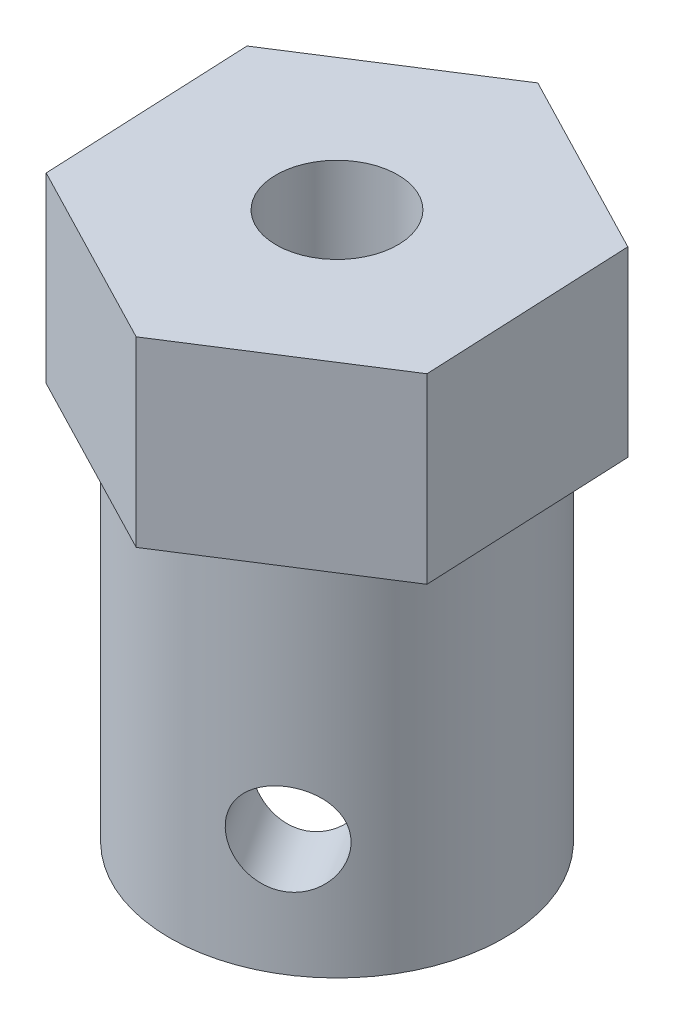
ISO-10303-21;
HEADER;
FILE_DESCRIPTION(('STEP AP214'),'2;1');
FILE_NAME('part.step','',(''),(''),'','','');
FILE_SCHEMA(('AUTOMOTIVE_DESIGN { 1 0 10303 214 1 1 1 1 }'));
ENDSEC;
DATA;
#1=APPLICATION_CONTEXT('core data for automotive mechanical design processes');
#2=APPLICATION_PROTOCOL_DEFINITION('international standard','automotive_design',2000,#1);
#3=PRODUCT_CONTEXT('',#1,'mechanical');
#4=PRODUCT('Part','Part','',(#3));
#5=PRODUCT_RELATED_PRODUCT_CATEGORY('part','',(#4));
#6=PRODUCT_DEFINITION_FORMATION('','',#4);
#7=PRODUCT_DEFINITION_CONTEXT('part definition',#1,'design');
#8=PRODUCT_DEFINITION('design','',#6,#7);
#9=PRODUCT_DEFINITION_SHAPE('','',#8);
#10=(LENGTH_UNIT() NAMED_UNIT(*) SI_UNIT(.MILLI.,.METRE.));
#11=(NAMED_UNIT(*) PLANE_ANGLE_UNIT() SI_UNIT($,.RADIAN.));
#12=(NAMED_UNIT(*) SI_UNIT($,.STERADIAN.) SOLID_ANGLE_UNIT());
#13=UNCERTAINTY_MEASURE_WITH_UNIT(LENGTH_MEASURE(1.E-05),#10,'distance_accuracy_value','');
#14=(GEOMETRIC_REPRESENTATION_CONTEXT(3) GLOBAL_UNCERTAINTY_ASSIGNED_CONTEXT((#13)) GLOBAL_UNIT_ASSIGNED_CONTEXT((#10,
#11,#12)) REPRESENTATION_CONTEXT('',''));
#15=CARTESIAN_POINT('',(0.,0.,0.));
#16=DIRECTION('',(0.,0.,1.));
#17=DIRECTION('',(1.,0.,0.));
#18=AXIS2_PLACEMENT_3D('',#15,#16,#17);
#19=CARTESIAN_POINT('',(0.,0.,0.));
#20=DIRECTION('',(0.,1.,0.));
#21=DIRECTION('',(0.,0.,1.));
#22=AXIS2_PLACEMENT_3D('',#19,#20,#21);
#23=PLANE('',#22);
#24=CARTESIAN_POINT('',(0.,0.,0.));
#25=DIRECTION('',(0.,1.,0.));
#26=DIRECTION('',(0.,0.,1.));
#27=AXIS2_PLACEMENT_3D('',#24,#25,#26);
#28=CIRCLE('',#27,2.);
#29=CARTESIAN_POINT('',(0.,0.,2.));
#30=VERTEX_POINT('',#29);
#31=EDGE_CURVE('E238',#30,#30,#28,.T.);
#32=ORIENTED_EDGE('',*,*,#31,.T.);
#33=EDGE_LOOP('',(#32));
#34=FACE_BOUND('',#33,.T.);
#35=CARTESIAN_POINT('',(0.,0.,0.));
#36=DIRECTION('',(0.,1.,0.));
#37=DIRECTION('',(0.,0.,1.));
#38=AXIS2_PLACEMENT_3D('',#35,#36,#37);
#39=CIRCLE('',#38,3.);
#40=CARTESIAN_POINT('',(0.,0.,3.));
#41=VERTEX_POINT('',#40);
#42=EDGE_CURVE('E12',#41,#41,#39,.T.);
#43=ORIENTED_EDGE('',*,*,#42,.F.);
#44=EDGE_LOOP('',(#43));
#45=FACE_BOUND('',#44,.T.);
#46=ADVANCED_FACE('F61',(#34,#45),#23,.F.);
#47=CARTESIAN_POINT('',(0.,6.,0.));
#48=DIRECTION('',(0.,1.,0.));
#49=DIRECTION('',(0.,0.,1.));
#50=AXIS2_PLACEMENT_3D('',#47,#48,#49);
#51=PLANE('',#50);
#52=DIRECTION('',(0.0452524047716099,0.,0.998975585218371));
#53=VECTOR('',#52,1.);
#54=CARTESIAN_POINT('',(-6.15061243976842,6.,-3.18903850960848));
#55=LINE('',#54,#53);
#56=CARTESIAN_POINT('',(-6.15061243976842,6.,-3.18903850960848));
#57=VERTEX_POINT('',#56);
#58=CARTESIAN_POINT('',(-5.83709458285202,6.,3.73206736686781));
#59=VERTEX_POINT('',#58);
#60=EDGE_CURVE('E165',#57,#59,#55,.T.);
#61=ORIENTED_EDGE('',*,*,#60,.T.);
#62=DIRECTION('',(0.887764436945341,0.,0.460298060494635));
#63=VECTOR('',#62,1.);
#64=CARTESIAN_POINT('',(-5.83709458285202,6.,3.73206736686781));
#65=LINE('',#64,#63);
#66=CARTESIAN_POINT('',(0.313517856916401,6.,6.92110587647628));
#67=VERTEX_POINT('',#66);
#68=EDGE_CURVE('E122',#59,#67,#65,.T.);
#69=ORIENTED_EDGE('',*,*,#68,.T.);
#70=DIRECTION('',(0.84251203217373,0.,-0.538677524723736));
#71=VECTOR('',#70,1.);
#72=CARTESIAN_POINT('',(0.313517856916401,6.,6.92110587647628));
#73=LINE('',#72,#71);
#74=CARTESIAN_POINT('',(6.15061243976842,6.,3.18903850960848));
#75=VERTEX_POINT('',#74);
#76=EDGE_CURVE('E136',#67,#75,#73,.T.);
#77=ORIENTED_EDGE('',*,*,#76,.T.);
#78=DIRECTION('',(-0.04525240477161,0.,-0.998975585218371));
#79=VECTOR('',#78,1.);
#80=CARTESIAN_POINT('',(6.15061243976842,6.,3.18903850960848));
#81=LINE('',#80,#79);
#82=CARTESIAN_POINT('',(5.83709458285202,6.,-3.7320673668678));
#83=VERTEX_POINT('',#82);
#84=EDGE_CURVE('E129',#75,#83,#81,.T.);
#85=ORIENTED_EDGE('',*,*,#84,.T.);
#86=DIRECTION('',(-0.88776443694534,0.,-0.460298060494635));
#87=VECTOR('',#86,1.);
#88=CARTESIAN_POINT('',(5.83709458285202,6.,-3.7320673668678));
#89=LINE('',#88,#87);
#90=CARTESIAN_POINT('',(-0.313517856916401,6.,-6.92110587647628));
#91=VERTEX_POINT('',#90);
#92=EDGE_CURVE('E134',#83,#91,#89,.T.);
#93=ORIENTED_EDGE('',*,*,#92,.T.);
#94=DIRECTION('',(-0.84251203217373,0.,0.538677524723736));
#95=VECTOR('',#94,1.);
#96=CARTESIAN_POINT('',(-0.313517856916401,6.,-6.92110587647628));
#97=LINE('',#96,#95);
#98=EDGE_CURVE('E84',#91,#57,#97,.T.);
#99=ORIENTED_EDGE('',*,*,#98,.T.);
#100=EDGE_LOOP('',(#61,#69,#77,#85,#93,#99));
#101=FACE_BOUND('',#100,.T.);
#102=CARTESIAN_POINT('',(0.,6.,0.));
#103=DIRECTION('',(0.,1.,0.));
#104=DIRECTION('',(0.,0.,1.));
#105=AXIS2_PLACEMENT_3D('',#102,#103,#104);
#106=CIRCLE('',#105,2.);
#107=CARTESIAN_POINT('',(0.,6.,2.));
#108=VERTEX_POINT('',#107);
#109=EDGE_CURVE('E158',#108,#108,#106,.T.);
#110=ORIENTED_EDGE('',*,*,#109,.F.);
#111=EDGE_LOOP('',(#110));
#112=FACE_BOUND('',#111,.T.);
#113=ADVANCED_FACE('F131',(#101,#112),#51,.T.);
#114=CARTESIAN_POINT('',(0.,0.,0.));
#115=DIRECTION('',(0.,1.,0.));
#116=DIRECTION('',(0.,0.,1.));
#117=AXIS2_PLACEMENT_3D('',#114,#115,#116);
#118=CIRCLE('',#117,5.5);
#119=CARTESIAN_POINT('',(0.,0.,5.5));
#120=VERTEX_POINT('',#119);
#121=EDGE_CURVE('E257',#120,#120,#118,.T.);
#122=ORIENTED_EDGE('',*,*,#121,.T.);
#123=EDGE_LOOP('',(#122));
#124=FACE_BOUND('',#123,.T.);
#125=DIRECTION('',(0.0452524047716099,0.,0.998975585218371));
#126=VECTOR('',#125,1.);
#127=CARTESIAN_POINT('',(-6.15061243976842,0.,-3.18903850960848));
#128=LINE('',#127,#126);
#129=CARTESIAN_POINT('',(-6.15061243976842,0.,-3.18903850960848));
#130=VERTEX_POINT('',#129);
#131=CARTESIAN_POINT('',(-5.83709458285202,0.,3.73206736686781));
#132=VERTEX_POINT('',#131);
#133=EDGE_CURVE('E154',#130,#132,#128,.T.);
#134=ORIENTED_EDGE('',*,*,#133,.F.);
#135=DIRECTION('',(-0.84251203217373,0.,0.538677524723736));
#136=VECTOR('',#135,1.);
#137=CARTESIAN_POINT('',(-0.313517856916401,0.,-6.92110587647628));
#138=LINE('',#137,#136);
#139=CARTESIAN_POINT('',(-0.313517856916401,0.,-6.92110587647628));
#140=VERTEX_POINT('',#139);
#141=EDGE_CURVE('E113',#140,#130,#138,.T.);
#142=ORIENTED_EDGE('',*,*,#141,.F.);
#143=DIRECTION('',(-0.88776443694534,0.,-0.460298060494635));
#144=VECTOR('',#143,1.);
#145=CARTESIAN_POINT('',(5.83709458285202,0.,-3.7320673668678));
#146=LINE('',#145,#144);
#147=CARTESIAN_POINT('',(5.83709458285202,0.,-3.7320673668678));
#148=VERTEX_POINT('',#147);
#149=EDGE_CURVE('E107',#148,#140,#146,.T.);
#150=ORIENTED_EDGE('',*,*,#149,.F.);
#151=DIRECTION('',(-0.04525240477161,0.,-0.998975585218371));
#152=VECTOR('',#151,1.);
#153=CARTESIAN_POINT('',(6.15061243976842,0.,3.18903850960848));
#154=LINE('',#153,#152);
#155=CARTESIAN_POINT('',(6.15061243976842,0.,3.18903850960848));
#156=VERTEX_POINT('',#155);
#157=EDGE_CURVE('E144',#156,#148,#154,.T.);
#158=ORIENTED_EDGE('',*,*,#157,.F.);
#159=DIRECTION('',(0.84251203217373,0.,-0.538677524723736));
#160=VECTOR('',#159,1.);
#161=CARTESIAN_POINT('',(0.313517856916401,0.,6.92110587647628));
#162=LINE('',#161,#160);
#163=CARTESIAN_POINT('',(0.313517856916401,0.,6.92110587647628));
#164=VERTEX_POINT('',#163);
#165=EDGE_CURVE('E160',#164,#156,#162,.T.);
#166=ORIENTED_EDGE('',*,*,#165,.F.);
#167=DIRECTION('',(0.887764436945341,0.,0.460298060494635));
#168=VECTOR('',#167,1.);
#169=CARTESIAN_POINT('',(-5.83709458285202,0.,3.73206736686781));
#170=LINE('',#169,#168);
#171=EDGE_CURVE('E157',#132,#164,#170,.T.);
#172=ORIENTED_EDGE('',*,*,#171,.F.);
#173=EDGE_LOOP('',(#134,#142,#150,#158,#166,#172));
#174=FACE_BOUND('',#173,.T.);
#175=ADVANCED_FACE('F212',(#124,#174),#23,.F.);
#176=CARTESIAN_POINT('',(-6.15061243976842,6.,-3.18903850960848));
#177=DIRECTION('',(0.998975585218371,0.,-0.0452524047716099));
#178=DIRECTION('',(-0.0452524047716099,0.,-0.998975585218371));
#179=AXIS2_PLACEMENT_3D('',#176,#177,#178);
#180=PLANE('',#179);
#181=ORIENTED_EDGE('',*,*,#133,.T.);
#182=DIRECTION('',(0.,-1.,0.));
#183=VECTOR('',#182,1.);
#184=CARTESIAN_POINT('',(-5.83709458285202,6.,3.73206736686781));
#185=LINE('',#184,#183);
#186=EDGE_CURVE('E75',#59,#132,#185,.T.);
#187=ORIENTED_EDGE('',*,*,#186,.F.);
#188=ORIENTED_EDGE('',*,*,#60,.F.);
#189=DIRECTION('',(0.,-1.,0.));
#190=VECTOR('',#189,1.);
#191=CARTESIAN_POINT('',(-6.15061243976842,6.,-3.18903850960848));
#192=LINE('',#191,#190);
#193=EDGE_CURVE('E150',#57,#130,#192,.T.);
#194=ORIENTED_EDGE('',*,*,#193,.T.);
#195=EDGE_LOOP('',(#181,#187,#188,#194));
#196=FACE_BOUND('',#195,.T.);
#197=ADVANCED_FACE('F63',(#196),#180,.F.);
#198=CARTESIAN_POINT('',(-5.83709458285202,6.,3.73206736686781));
#199=DIRECTION('',(0.460298060494635,0.,-0.887764436945341));
#200=DIRECTION('',(-0.887764436945341,0.,-0.460298060494635));
#201=AXIS2_PLACEMENT_3D('',#198,#199,#200);
#202=PLANE('',#201);
#203=ORIENTED_EDGE('',*,*,#171,.T.);
#204=DIRECTION('',(0.,-1.,0.));
#205=VECTOR('',#204,1.);
#206=CARTESIAN_POINT('',(0.313517856916401,6.,6.92110587647628));
#207=LINE('',#206,#205);
#208=EDGE_CURVE('E169',#67,#164,#207,.T.);
#209=ORIENTED_EDGE('',*,*,#208,.F.);
#210=ORIENTED_EDGE('',*,*,#68,.F.);
#211=ORIENTED_EDGE('',*,*,#186,.T.);
#212=EDGE_LOOP('',(#203,#209,#210,#211));
#213=FACE_BOUND('',#212,.T.);
#214=ADVANCED_FACE('F224',(#213),#202,.F.);
#215=CARTESIAN_POINT('',(0.313517856916401,6.,6.92110587647628));
#216=DIRECTION('',(-0.538677524723736,0.,-0.84251203217373));
#217=DIRECTION('',(-0.84251203217373,0.,0.538677524723736));
#218=AXIS2_PLACEMENT_3D('',#215,#216,#217);
#219=PLANE('',#218);
#220=ORIENTED_EDGE('',*,*,#165,.T.);
#221=DIRECTION('',(0.,-1.,0.));
#222=VECTOR('',#221,1.);
#223=CARTESIAN_POINT('',(6.15061243976842,6.,3.18903850960848));
#224=LINE('',#223,#222);
#225=EDGE_CURVE('E145',#75,#156,#224,.T.);
#226=ORIENTED_EDGE('',*,*,#225,.F.);
#227=ORIENTED_EDGE('',*,*,#76,.F.);
#228=ORIENTED_EDGE('',*,*,#208,.T.);
#229=EDGE_LOOP('',(#220,#226,#227,#228));
#230=FACE_BOUND('',#229,.T.);
#231=ADVANCED_FACE('F222',(#230),#219,.F.);
#232=CARTESIAN_POINT('',(6.15061243976842,6.,3.18903850960848));
#233=DIRECTION('',(-0.998975585218371,0.,0.04525240477161));
#234=DIRECTION('',(0.04525240477161,0.,0.998975585218371));
#235=AXIS2_PLACEMENT_3D('',#232,#233,#234);
#236=PLANE('',#235);
#237=ORIENTED_EDGE('',*,*,#157,.T.);
#238=DIRECTION('',(0.,-1.,0.));
#239=VECTOR('',#238,1.);
#240=CARTESIAN_POINT('',(5.83709458285202,6.,-3.7320673668678));
#241=LINE('',#240,#239);
#242=EDGE_CURVE('E141',#83,#148,#241,.T.);
#243=ORIENTED_EDGE('',*,*,#242,.F.);
#244=ORIENTED_EDGE('',*,*,#84,.F.);
#245=ORIENTED_EDGE('',*,*,#225,.T.);
#246=EDGE_LOOP('',(#237,#243,#244,#245));
#247=FACE_BOUND('',#246,.T.);
#248=ADVANCED_FACE('F142',(#247),#236,.F.);
#249=CARTESIAN_POINT('',(5.83709458285202,6.,-3.7320673668678));
#250=DIRECTION('',(-0.460298060494635,0.,0.88776443694534));
#251=DIRECTION('',(0.88776443694534,0.,0.460298060494635));
#252=AXIS2_PLACEMENT_3D('',#249,#250,#251);
#253=PLANE('',#252);
#254=ORIENTED_EDGE('',*,*,#149,.T.);
#255=DIRECTION('',(0.,-1.,0.));
#256=VECTOR('',#255,1.);
#257=CARTESIAN_POINT('',(-0.313517856916401,6.,-6.92110587647628));
#258=LINE('',#257,#256);
#259=EDGE_CURVE('E146',#91,#140,#258,.T.);
#260=ORIENTED_EDGE('',*,*,#259,.F.);
#261=ORIENTED_EDGE('',*,*,#92,.F.);
#262=ORIENTED_EDGE('',*,*,#242,.T.);
#263=EDGE_LOOP('',(#254,#260,#261,#262));
#264=FACE_BOUND('',#263,.T.);
#265=ADVANCED_FACE('F148',(#264),#253,.F.);
#266=CARTESIAN_POINT('',(-0.313517856916401,6.,-6.92110587647628));
#267=DIRECTION('',(0.538677524723736,0.,0.84251203217373));
#268=DIRECTION('',(0.84251203217373,0.,-0.538677524723736));
#269=AXIS2_PLACEMENT_3D('',#266,#267,#268);
#270=PLANE('',#269);
#271=ORIENTED_EDGE('',*,*,#141,.T.);
#272=ORIENTED_EDGE('',*,*,#193,.F.);
#273=ORIENTED_EDGE('',*,*,#98,.F.);
#274=ORIENTED_EDGE('',*,*,#259,.T.);
#275=EDGE_LOOP('',(#271,#272,#273,#274));
#276=FACE_BOUND('',#275,.T.);
#277=ADVANCED_FACE('F208',(#276),#270,.F.);
#278=CARTESIAN_POINT('',(0.,6.,0.));
#279=DIRECTION('',(0.,-1.,0.));
#280=DIRECTION('',(0.,0.,-1.));
#281=AXIS2_PLACEMENT_3D('',#278,#279,#280);
#282=CYLINDRICAL_SURFACE('',#281,2.);
#283=ORIENTED_EDGE('',*,*,#109,.T.);
#284=EDGE_LOOP('',(#283));
#285=FACE_BOUND('',#284,.T.);
#286=ORIENTED_EDGE('',*,*,#31,.F.);
#287=EDGE_LOOP('',(#286));
#288=FACE_BOUND('',#287,.T.);
#289=ADVANCED_FACE('F203',(#285,#288),#282,.F.);
#290=CARTESIAN_POINT('',(0.,-12.,0.));
#291=DIRECTION('',(0.,1.,0.));
#292=DIRECTION('',(0.,0.,1.));
#293=AXIS2_PLACEMENT_3D('',#290,#291,#292);
#294=CYLINDRICAL_SURFACE('',#293,5.5);
#295=CARTESIAN_POINT('',(-1.58664548629711,-8.13531336875809,-5.26617091450828));
#296=CARTESIAN_POINT('',(-1.58664777016669,-8.21786981978584,-5.26617106516967));
#297=CARTESIAN_POINT('',(-1.59345936672199,-8.30044547871361,-5.26413257461352));
#298=CARTESIAN_POINT('',(-1.62038031709061,-8.4632068940581,-5.25590708693958));
#299=CARTESIAN_POINT('',(-1.64049594478426,-8.54339150425664,-5.24971813253758));
#300=CARTESIAN_POINT('',(-1.693050107084,-8.69899255671995,-5.23300435444098));
#301=CARTESIAN_POINT('',(-1.72547077097341,-8.77441572966232,-5.22248581677659));
#302=CARTESIAN_POINT('',(-1.80127198306013,-8.9186715029948,-5.19682728662904));
#303=CARTESIAN_POINT('',(-1.84465352505905,-8.98750350499539,-5.18168687506357));
#304=CARTESIAN_POINT('',(-1.94188458740173,-9.11842357554944,-5.14604909490239));
#305=CARTESIAN_POINT('',(-1.99595737215188,-9.18031369713614,-5.1254335241561));
#306=CARTESIAN_POINT('',(-2.11195017653896,-9.29384102648359,-5.07873697476655));
#307=CARTESIAN_POINT('',(-2.1738710404009,-9.34547712967411,-5.05265540794358));
#308=CARTESIAN_POINT('',(-2.30457188515124,-9.43786199556857,-4.99441133365275));
#309=CARTESIAN_POINT('',(-2.37344969328434,-9.47841309058454,-4.9621539507149));
#310=CARTESIAN_POINT('',(-2.51481410486096,-9.54618623694096,-4.89202673795153));
#311=CARTESIAN_POINT('',(-2.58730006818645,-9.57341064333231,-4.8541579013066));
#312=CARTESIAN_POINT('',(-2.73167864239386,-9.61311446703863,-4.77436584608916));
#313=CARTESIAN_POINT('',(-2.80354401383391,-9.62593081297283,-4.7325611906872));
#314=CARTESIAN_POINT('',(-2.94608718339089,-9.63751567105605,-4.6451646049233));
#315=CARTESIAN_POINT('',(-3.01676518689381,-9.63628663830257,-4.5995733378348));
#316=CARTESIAN_POINT('',(-3.15299761147534,-9.6200509701097,-4.50723903067167));
#317=CARTESIAN_POINT('',(-3.21863799263807,-9.60540849543884,-4.4605580635869));
#318=CARTESIAN_POINT('',(-3.34514127100844,-9.56335103641251,-4.36649137432479));
#319=CARTESIAN_POINT('',(-3.40600388945077,-9.53593530742975,-4.31910561121671));
#320=CARTESIAN_POINT('',(-3.52224280421983,-9.46883623291507,-4.22486293086914));
#321=CARTESIAN_POINT('',(-3.57755641118083,-9.42902992007039,-4.17801642617775));
#322=CARTESIAN_POINT('',(-3.68100820702582,-9.3383744744907,-4.08716594852856));
#323=CARTESIAN_POINT('',(-3.72914493877198,-9.28752310438675,-4.04316255383889));
#324=CARTESIAN_POINT('',(-3.81895967792232,-9.17429537363724,-3.95846983103785));
#325=CARTESIAN_POINT('',(-3.8603810350516,-9.11160169681731,-3.9179320489933));
#326=CARTESIAN_POINT('',(-3.93427182057672,-8.97746815364475,-3.84372929781715));
#327=CARTESIAN_POINT('',(-3.96674065002523,-8.90602770257171,-3.81006478856443));
#328=CARTESIAN_POINT('',(-4.02248080978718,-8.75575897475774,-3.75117457035836));
#329=CARTESIAN_POINT('',(-4.04568899406952,-8.67688436298389,-3.72600697279649));
#330=CARTESIAN_POINT('',(-4.08224446318487,-8.51439076652899,-3.68592244763783));
#331=CARTESIAN_POINT('',(-4.09559432347185,-8.43077302712528,-3.67100284285863));
#332=CARTESIAN_POINT('',(-4.11196129700803,-8.26396118724811,-3.65265954797318));
#333=CARTESIAN_POINT('',(-4.11528762997759,-8.18083518199399,-3.64889189406068));
#334=CARTESIAN_POINT('',(-4.11243165437271,-8.01496222521603,-3.65211046293392));
#335=CARTESIAN_POINT('',(-4.10625041096462,-7.93221523227181,-3.65909548106106));
#336=CARTESIAN_POINT('',(-4.08470617552967,-7.77119093144673,-3.68312697318836));
#337=CARTESIAN_POINT('',(-4.06953246135745,-7.69285694812831,-3.69996594705448));
#338=CARTESIAN_POINT('',(-4.03038055800088,-7.54096735882748,-3.7425745523789));
#339=CARTESIAN_POINT('',(-4.00640118043988,-7.46741239938041,-3.76834538921884));
#340=CARTESIAN_POINT('',(-3.94930052562109,-7.32531266059111,-3.82815452486727));
#341=CARTESIAN_POINT('',(-3.9159828514383,-7.25692079425312,-3.86236830140298));
#342=CARTESIAN_POINT('',(-3.8408745072584,-7.12874730337295,-3.93706526236668));
#343=CARTESIAN_POINT('',(-3.79908216843843,-7.06896737865797,-3.97754968123216));
#344=CARTESIAN_POINT('',(-3.70617184009726,-6.95784700480749,-4.06428875366022));
#345=CARTESIAN_POINT('',(-3.65480897170384,-6.9068183653239,-4.11068140920305));
#346=CARTESIAN_POINT('',(-3.54449139129223,-6.81694273366711,-4.20617342213235));
#347=CARTESIAN_POINT('',(-3.48553708339561,-6.77809509343028,-4.2552726353588));
#348=CARTESIAN_POINT('',(-3.36169152581016,-6.71404630250018,-4.3537610409909));
#349=CARTESIAN_POINT('',(-3.29684943281606,-6.6887424784576,-4.40314509758631));
#350=CARTESIAN_POINT('',(-3.16243311213076,-6.65220641621302,-4.50065572057294));
#351=CARTESIAN_POINT('',(-3.09285998911574,-6.64097090493117,-4.54878257690733));
#352=CARTESIAN_POINT('',(-2.95324410559726,-6.63310324866752,-4.64059348656859));
#353=CARTESIAN_POINT('',(-2.88328783052829,-6.63601469745139,-4.68437048685015));
#354=CARTESIAN_POINT('',(-2.7428655361739,-6.65529314606808,-4.76795188886995));
#355=CARTESIAN_POINT('',(-2.67239953773437,-6.67165959868837,-4.80775645209264));
#356=CARTESIAN_POINT('',(-2.53365758754882,-6.71712073909757,-4.88228841172423));
#357=CARTESIAN_POINT('',(-2.46536917612926,-6.74611906699834,-4.91705164011164));
#358=CARTESIAN_POINT('',(-2.33251961284288,-6.8159349902932,-4.98144638594317));
#359=CARTESIAN_POINT('',(-2.26795900340167,-6.85675430056471,-5.01107715782113));
#360=CARTESIAN_POINT('',(-2.14285199702232,-6.9503680970398,-5.06586434482068));
#361=CARTESIAN_POINT('',(-2.08246591334054,-7.00346244119474,-5.09087442101908));
#362=CARTESIAN_POINT('',(-1.96974695776189,-7.11955550730832,-5.13554092608867));
#363=CARTESIAN_POINT('',(-1.91741624181717,-7.18255687170936,-5.15519592279741));
#364=CARTESIAN_POINT('',(-1.82159069743897,-7.31844089558902,-5.18984292567382));
#365=CARTESIAN_POINT('',(-1.77833013066899,-7.3915195714389,-5.20471562570376));
#366=CARTESIAN_POINT('',(-1.70404793372958,-7.54439931390771,-5.22950897578839));
#367=CARTESIAN_POINT('',(-1.67301865106361,-7.6241961392684,-5.23943272318656));
#368=CARTESIAN_POINT('',(-1.62834502170823,-7.77558138801065,-5.2534703137873));
#369=CARTESIAN_POINT('',(-1.61275947367049,-7.84654183750962,-5.25824346440209));
#370=CARTESIAN_POINT('',(-1.59190935457165,-7.99010116666081,-5.26459349627581));
#371=CARTESIAN_POINT('',(-1.58664347749183,-8.0626998378094,-5.26617078199223));
#372=CARTESIAN_POINT('',(-1.58664548629711,-8.13531336875809,-5.26617091450828));
#373=B_SPLINE_CURVE_WITH_KNOTS('',3,(#295,#296,#297,#298,#299,#300,#301,#302,#303,#304,#305,
#306,#307,#308,#309,#310,#311,#312,#313,#314,#315,#316,#317,#318,#319,#320,#321,#322,#323,#324,
#325,#326,#327,#328,#329,#330,#331,#332,#333,#334,#335,#336,#337,#338,#339,#340,#341,#342,#343,
#344,#345,#346,#347,#348,#349,#350,#351,#352,#353,#354,#355,#356,#357,#358,#359,#360,#361,#362,
#363,#364,#365,#366,#367,#368,#369,#370,#371,#372),.UNSPECIFIED.,.T.,.F.,(4,2,2,2,2,2,2,2,2,2,2,
2,2,2,2,2,2,2,2,2,2,2,2,2,2,2,2,2,2,2,2,2,2,2,2,2,2,2,4),(0.,0.247402201391967,
0.494921155336741,0.742082002291409,0.989265266888851,1.24229327000825,1.49534851471804,
1.75265882819585,2.00992365416646,2.26103843021061,2.51210931268384,2.75655962385663,
3.0010241872433,3.24799669713117,3.49501928234234,3.74996416866223,4.00492610732058,
4.26159801830625,4.51820285087414,4.76680611540842,5.01538153009582,5.25890187447337,
5.50245509545498,5.75157425489228,6.0007425183582,6.25748556676548,6.51421495339717,
6.76896951768222,7.02366480072505,7.27019876040454,7.51672269408902,7.76139812559489,
8.00610907011738,8.25758505394755,8.50912822664454,8.76653181226182,9.02377409687475,
9.24140725781328,9.45901287413893),.UNSPECIFIED.);
#374=CARTESIAN_POINT('',(-1.58664548629711,-8.13531336875809,-5.26617091450828));
#375=VERTEX_POINT('',#374);
#376=EDGE_CURVE('E194',#375,#375,#373,.T.);
#377=ORIENTED_EDGE('',*,*,#376,.F.);
#378=EDGE_LOOP('',(#377));
#379=FACE_BOUND('',#378,.T.);
#380=CARTESIAN_POINT('',(4.1141815828183,-8.13531336875809,3.65013834033708));
#381=CARTESIAN_POINT('',(4.11418076113849,-8.05275691773035,3.65014047659581));
#382=CARTESIAN_POINT('',(4.10947194740852,-7.97018125880258,3.65546779905988));
#383=CARTESIAN_POINT('',(4.09070834008802,-7.80741984345809,3.67645167993415));
#384=CARTESIAN_POINT('',(4.07664913704777,-7.72723523325955,3.6921131116686));
#385=CARTESIAN_POINT('',(4.03942378376224,-7.57163418079625,3.73280172710409));
#386=CARTESIAN_POINT('',(4.01627083875048,-7.49621100785387,3.75781532778272));
#387=CARTESIAN_POINT('',(3.96117077653158,-7.35195523452139,3.81585123965306));
#388=CARTESIAN_POINT('',(3.92922286187801,-7.2831232325208,3.84887427703401));
#389=CARTESIAN_POINT('',(3.85607168618777,-7.15220316196675,3.92217391110021));
#390=CARTESIAN_POINT('',(3.81466744129146,-7.09031304038005,3.96260355755424));
#391=CARTESIAN_POINT('',(3.7236049689171,-6.9767857110326,4.04829208957305));
#392=CARTESIAN_POINT('',(3.67394585327578,-6.92514960784208,4.09355149459646));
#393=CARTESIAN_POINT('',(3.56622959649277,-6.83276474194762,4.18774433420279));
#394=CARTESIAN_POINT('',(3.50804528484731,-6.79221364693165,4.23672675028819));
#395=CARTESIAN_POINT('',(3.38506788803837,-6.72444050057523,4.33561194991108));
#396=CARTESIAN_POINT('',(3.32027597299708,-6.69721609418388,4.38551456921456));
#397=CARTESIAN_POINT('',(3.18726104507035,-6.65751227047756,4.48307979721425));
#398=CARTESIAN_POINT('',(3.11915708126281,-6.64469592454336,4.53076743648476));
#399=CARTESIAN_POINT('',(2.9800098712862,-6.63311106646014,4.62347543153515));
#400=CARTESIAN_POINT('',(2.90896714096935,-6.63434009921362,4.66849625208544));
#401=CARTESIAN_POINT('',(2.76798636072728,-6.65057576740649,4.75340395131816));
#402=CARTESIAN_POINT('',(2.69806858008716,-6.66521824207735,4.7933949037639));
#403=CARTESIAN_POINT('',(2.55959820917515,-6.70727570110368,4.86874460745725));
#404=CARTESIAN_POINT('',(2.49104569873577,-6.73469143008644,4.90410308849717));
#405=CARTESIAN_POINT('',(2.35672305490555,-6.80179050460112,4.97006213230652));
#406=CARTESIAN_POINT('',(2.29098868060764,-6.8415968174458,5.00061016256215));
#407=CARTESIAN_POINT('',(2.16511124034073,-6.9322522630255,5.05638608375122));
#408=CARTESIAN_POINT('',(2.10496931074913,-6.98310363312944,5.0816128947351));
#409=CARTESIAN_POINT('',(1.99040400209712,-7.09633136387895,5.12759479027635));
#410=CARTESIAN_POINT('',(1.93622588313687,-7.15902504069888,5.1481805141026));
#411=CARTESIAN_POINT('',(1.83786469578657,-7.29315858387144,5.18411063086653));
#412=CARTESIAN_POINT('',(1.79368229617157,-7.36459903494449,5.1994546731385));
#413=CARTESIAN_POINT('',(1.71683702450158,-7.51486776275846,5.22533569770497));
#414=CARTESIAN_POINT('',(1.68425339868571,-7.59374237453231,5.23583974994259));
#415=CARTESIAN_POINT('',(1.63252867875679,-7.75623597098721,5.25219899282583));
#416=CARTESIAN_POINT('',(1.61338407380939,-7.83985371039092,5.25805539768356));
#417=CARTESIAN_POINT('',(1.58986569733114,-8.00666555026808,5.26521362775922));
#418=CARTESIAN_POINT('',(1.58504995015475,-8.08979155552221,5.26665178149294));
#419=CARTESIAN_POINT('',(1.5891699143992,-8.25566451230016,5.26541013868118));
#420=CARTESIAN_POINT('',(1.59810408536966,-8.33841150524438,5.26273080343213));
#421=CARTESIAN_POINT('',(1.62895820458089,-8.49943580606946,5.25326032181601));
#422=CARTESIAN_POINT('',(1.65061037711835,-8.57776978938788,5.24655390197738));
#423=CARTESIAN_POINT('',(1.70571576726803,-8.72965937868871,5.2288971536758));
#424=CARTESIAN_POINT('',(1.73917057769248,-8.80321433813578,5.21794625238376));
#425=CARTESIAN_POINT('',(1.81742087246467,-8.94531407692508,5.19121595392279));
#426=CARTESIAN_POINT('',(1.86245805381,-9.01370594326308,5.17533193005431));
#427=CARTESIAN_POINT('',(1.96177877997117,-9.14187943414324,5.13850405070354));
#428=CARTESIAN_POINT('',(2.01606414559352,-9.20165935885822,5.11755919849191));
#429=CARTESIAN_POINT('',(2.1337859677135,-9.3127797327087,5.06962624119844));
#430=CARTESIAN_POINT('',(2.19745045064757,-9.36380837219229,5.0424737762891));
#431=CARTESIAN_POINT('',(2.33042218839704,-9.45368400384908,4.98241372266736));
#432=CARTESIAN_POINT('',(2.39972914276978,-9.49253164408591,4.94950644027269));
#433=CARTESIAN_POINT('',(2.54109771687136,-9.55658043501601,4.87842469554109));
#434=CARTESIAN_POINT('',(2.61313404614758,-9.58188425905859,4.84029269672014));
#435=CARTESIAN_POINT('',(2.75805115496957,-9.61842032130317,4.75920570372809));
#436=CARTESIAN_POINT('',(2.83093173411155,-9.62965583258502,4.71625183393009));
#437=CARTESIAN_POINT('',(2.97285731336373,-9.63752348884866,4.628053375795));
#438=CARTESIAN_POINT('',(3.04195038611634,-9.6346120400648,4.58292629442716));
#439=CARTESIAN_POINT('',(3.17674458084775,-9.61533359144811,4.49054233163028));
#440=CARTESIAN_POINT('',(3.24244584065546,-9.59896713882782,4.44328553689017));
#441=CARTESIAN_POINT('',(3.36832083441081,-9.55350599841862,4.34862917051735));
#442=CARTESIAN_POINT('',(3.42853232123324,-9.52450767051786,4.30123332642998));
#443=CARTESIAN_POINT('',(3.54273316408918,-9.45469174722299,4.20767127617945));
#444=CARTESIAN_POINT('',(3.59672161575322,-9.41387243695148,4.16150524948857));
#445=CARTESIAN_POINT('',(3.69895263787897,-9.32025864047639,4.07093915749133));
#446=CARTESIAN_POINT('',(3.74699510280808,-9.26716429632145,4.02662319448242));
#447=CARTESIAN_POINT('',(3.83484105459848,-9.15107123020787,3.94305437029594));
#448=CARTESIAN_POINT('',(3.87464233675609,-9.08806986580683,3.90380286503156));
#449=CARTESIAN_POINT('',(3.94630436927193,-8.95218584192717,3.83136321525747));
#450=CARTESIAN_POINT('',(3.97795851866594,-8.87910716607729,3.79833763926579));
#451=CARTESIAN_POINT('',(4.03163581093473,-8.72622742360847,3.74131743858871));
#452=CARTESIAN_POINT('',(4.05366497661399,-8.64643059824779,3.71731716765975));
#453=CARTESIAN_POINT('',(4.0851541060684,-8.49504534950553,3.68265852031367));
#454=CARTESIAN_POINT('',(4.09602714408706,-8.42408490000657,3.67051482570813));
#455=CARTESIAN_POINT('',(4.11054078622397,-8.28052557085538,3.65425430409427));
#456=CARTESIAN_POINT('',(4.11418230553678,-8.20792689970679,3.65013646136471));
#457=CARTESIAN_POINT('',(4.1141815828183,-8.13531336875809,3.65013834033708));
#458=B_SPLINE_CURVE_WITH_KNOTS('',3,(#380,#381,#382,#383,#384,#385,#386,#387,#388,#389,#390,
#391,#392,#393,#394,#395,#396,#397,#398,#399,#400,#401,#402,#403,#404,#405,#406,#407,#408,#409,
#410,#411,#412,#413,#414,#415,#416,#417,#418,#419,#420,#421,#422,#423,#424,#425,#426,#427,#428,
#429,#430,#431,#432,#433,#434,#435,#436,#437,#438,#439,#440,#441,#442,#443,#444,#445,#446,#447,
#448,#449,#450,#451,#452,#453,#454,#455,#456,#457),.UNSPECIFIED.,.T.,.F.,(4,2,2,2,2,2,2,2,2,2,2,
2,2,2,2,2,2,2,2,2,2,2,2,2,2,2,2,2,2,2,2,2,2,2,2,2,2,2,4),(0.,0.247402201391969,
0.494921155336742,0.742082002291412,0.989265266888854,1.24229327000825,1.49534851471804,
1.75265882819585,2.00992365416647,2.26103843021061,2.51210931268384,2.75655962385664,
3.0010241872433,3.24799669713118,3.49501928234234,3.74996416866223,4.00492610732058,
4.26159801830625,4.51820285087414,4.76680611540842,5.01538153009582,5.25890187447337,
5.50245509545498,5.75157425489228,6.00074251835821,6.25748556676549,6.51421495339717,
6.76896951768223,7.02366480072505,7.27019876040454,7.51672269408902,7.76139812559489,
8.00610907011738,8.25758505394755,8.50912822664455,8.76653181226182,9.02377409687475,
9.24140725781328,9.45901287413893),.UNSPECIFIED.);
#459=CARTESIAN_POINT('',(4.1141815828183,-8.13531336875809,3.65013834033708));
#460=VERTEX_POINT('',#459);
#461=EDGE_CURVE('E189',#460,#460,#458,.T.);
#462=ORIENTED_EDGE('',*,*,#461,.F.);
#463=EDGE_LOOP('',(#462));
#464=FACE_BOUND('',#463,.T.);
#465=CARTESIAN_POINT('',(0.,-12.,0.));
#466=DIRECTION('',(0.,1.,0.));
#467=DIRECTION('',(0.,0.,1.));
#468=AXIS2_PLACEMENT_3D('',#465,#466,#467);
#469=CIRCLE('',#468,5.5);
#470=CARTESIAN_POINT('',(0.,-12.,5.5));
#471=VERTEX_POINT('',#470);
#472=EDGE_CURVE('E259',#471,#471,#469,.T.);
#473=ORIENTED_EDGE('',*,*,#472,.T.);
#474=EDGE_LOOP('',(#473));
#475=FACE_BOUND('',#474,.T.);
#476=ORIENTED_EDGE('',*,*,#121,.F.);
#477=EDGE_LOOP('',(#476));
#478=FACE_BOUND('',#477,.T.);
#479=ADVANCED_FACE('F198',(#379,#464,#475,#478),#294,.T.);
#480=CARTESIAN_POINT('',(0.,-12.,0.));
#481=DIRECTION('',(0.,1.,0.));
#482=DIRECTION('',(0.,0.,1.));
#483=AXIS2_PLACEMENT_3D('',#480,#481,#482);
#484=PLANE('',#483);
#485=CARTESIAN_POINT('',(0.,-12.,0.));
#486=DIRECTION('',(0.,1.,0.));
#487=DIRECTION('',(0.,0.,1.));
#488=AXIS2_PLACEMENT_3D('',#485,#486,#487);
#489=CIRCLE('',#488,3.);
#490=CARTESIAN_POINT('',(0.,-12.,3.));
#491=VERTEX_POINT('',#490);
#492=EDGE_CURVE('E256',#491,#491,#489,.T.);
#493=ORIENTED_EDGE('',*,*,#492,.T.);
#494=EDGE_LOOP('',(#493));
#495=FACE_BOUND('',#494,.T.);
#496=ORIENTED_EDGE('',*,*,#472,.F.);
#497=EDGE_LOOP('',(#496));
#498=FACE_BOUND('',#497,.T.);
#499=ADVANCED_FACE('F202',(#495,#498),#484,.F.);
#500=CARTESIAN_POINT('',(0.,-12.,0.));
#501=DIRECTION('',(0.,1.,0.));
#502=DIRECTION('',(0.,0.,1.));
#503=AXIS2_PLACEMENT_3D('',#500,#501,#502);
#504=CYLINDRICAL_SURFACE('',#503,3.);
#505=CARTESIAN_POINT('',(-0.135757214314832,-8.13531336875809,-2.99692675565511));
#506=CARTESIAN_POINT('',(-0.135765478709268,-8.21347508105097,-2.99692955410777));
#507=CARTESIAN_POINT('',(-0.142867600261145,-8.29173548604566,-2.99663073776001));
#508=CARTESIAN_POINT('',(-0.170733430671998,-8.44585426577382,-2.99516818584551));
#509=CARTESIAN_POINT('',(-0.191525846421211,-8.52170724132321,-2.99400263216947));
#510=CARTESIAN_POINT('',(-0.245150302743799,-8.66849086527401,-2.99008577279785));
#511=CARTESIAN_POINT('',(-0.277918317664711,-8.73944534746847,-2.9873428563033));
#512=CARTESIAN_POINT('',(-0.353693995365416,-8.87544967175317,-2.97932002210525));
#513=CARTESIAN_POINT('',(-0.396702212088567,-8.94049919415178,-2.97403996713959));
#514=CARTESIAN_POINT('',(-0.495088167249594,-9.06877196159435,-2.9593169856279));
#515=CARTESIAN_POINT('',(-0.551193550293477,-9.13140207226841,-2.94956663211321));
#516=CARTESIAN_POINT('',(-0.671239650781639,-9.24742595136816,-2.92458497221559));
#517=CARTESIAN_POINT('',(-0.735184249556118,-9.30081511263337,-2.90935094348485));
#518=CARTESIAN_POINT('',(-0.873359465543048,-9.40036409547959,-2.87101305005776));
#519=CARTESIAN_POINT('',(-0.947992887542169,-9.44579402054739,-2.8474479206737));
#520=CARTESIAN_POINT('',(-1.10106071336867,-9.52302464862674,-2.79182325239472));
#521=CARTESIAN_POINT('',(-1.17949268349959,-9.55483395296385,-2.75976909502386));
#522=CARTESIAN_POINT('',(-1.33142828546599,-9.60157036070974,-2.68957158944683));
#523=CARTESIAN_POINT('',(-1.40488549313404,-9.6175376582914,-2.65202380265937));
#524=CARTESIAN_POINT('',(-1.5496567720573,-9.63556254677065,-2.57010986295481));
#525=CARTESIAN_POINT('',(-1.6209721140219,-9.63762855395166,-2.52574785223071));
#526=CARTESIAN_POINT('',(-1.75292026447932,-9.62819335780257,-2.43579426912657));
#527=CARTESIAN_POINT('',(-1.81394273524824,-9.61785634547626,-2.39064509330705));
#528=CARTESIAN_POINT('',(-1.93060867050621,-9.58599210290111,-2.29746057639519));
#529=CARTESIAN_POINT('',(-1.9862517321173,-9.56446403529376,-2.24942501957044));
#530=CARTESIAN_POINT('',(-2.09190806560454,-9.51068951962338,-2.15155371242408));
#531=CARTESIAN_POINT('',(-2.14183279574332,-9.478298899,-2.10170225057359));
#532=CARTESIAN_POINT('',(-2.23470192727928,-9.40391824445586,-2.00267880182656));
#533=CARTESIAN_POINT('',(-2.27764382017572,-9.36192477380457,-1.95350706489175));
#534=CARTESIAN_POINT('',(-2.36019984294031,-9.26497034145857,-1.85312404703801));
#535=CARTESIAN_POINT('',(-2.39911570383487,-9.20915882626908,-1.80215934387027));
#536=CARTESIAN_POINT('',(-2.46870948337901,-9.08842878136283,-1.70558608086115));
#537=CARTESIAN_POINT('',(-2.49938107070245,-9.023503310347,-1.65998165256907));
#538=CARTESIAN_POINT('',(-2.55444718117315,-8.88134108012196,-1.57402981340679));
#539=CARTESIAN_POINT('',(-2.57831939603817,-8.80358433417678,-1.53420015417541));
#540=CARTESIAN_POINT('',(-2.61727891899595,-8.6409068617196,-1.46675937837226));
#541=CARTESIAN_POINT('',(-2.63237539645063,-8.55599371923175,-1.43913551579676));
#542=CARTESIAN_POINT('',(-2.65306779648197,-8.38849160183391,-1.4005990403221));
#543=CARTESIAN_POINT('',(-2.65932179254218,-8.30625169019277,-1.38853560827925));
#544=CARTESIAN_POINT('',(-2.66450610122456,-8.14071135648328,-1.37856694605129));
#545=CARTESIAN_POINT('',(-2.66344158716669,-8.05741172507842,-1.38065171475035));
#546=CARTESIAN_POINT('',(-2.65452190195131,-7.90183249089,-1.39770557056908));
#547=CARTESIAN_POINT('',(-2.64742230594715,-7.82934419209621,-1.41124028207186));
#548=CARTESIAN_POINT('',(-2.62741473793037,-7.68776168935166,-1.44814674357972));
#549=CARTESIAN_POINT('',(-2.6145048848487,-7.61866859263818,-1.47152167919597));
#550=CARTESIAN_POINT('',(-2.58207516602102,-7.48219637240405,-1.52773779241007));
#551=CARTESIAN_POINT('',(-2.56227684902201,-7.41504484347777,-1.5609672594998));
#552=CARTESIAN_POINT('',(-2.51608630365512,-7.2871094614496,-1.63437743062471));
#553=CARTESIAN_POINT('',(-2.48969068673974,-7.22632890348817,-1.67456170355985));
#554=CARTESIAN_POINT('',(-2.42631849270365,-7.10484521747277,-1.76533590050536));
#555=CARTESIAN_POINT('',(-2.38842755586713,-7.04511764268161,-1.81659898623533));
#556=CARTESIAN_POINT('',(-2.30372700513066,-6.93619501176771,-1.9228776587624));
#557=CARTESIAN_POINT('',(-2.25691438865679,-6.88700351341229,-1.97789450486684));
#558=CARTESIAN_POINT('',(-2.15302426035456,-6.79945277983294,-2.09057506464573));
#559=CARTESIAN_POINT('',(-2.09570844531189,-6.76141369144173,-2.14827031318169));
#560=CARTESIAN_POINT('',(-1.97240145948239,-6.69960651297201,-2.2619997289737));
#561=CARTESIAN_POINT('',(-1.90641796873094,-6.67582589170864,-2.31803531353965));
#562=CARTESIAN_POINT('',(-1.77381885143506,-6.6452605224961,-2.42073251970881));
#563=CARTESIAN_POINT('',(-1.70781671178098,-6.63711655494392,-2.46778248884418));
#564=CARTESIAN_POINT('',(-1.5719818957553,-6.63404847057649,-2.55645089548922));
#565=CARTESIAN_POINT('',(-1.50215056869614,-6.63911972597275,-2.5980712290224));
#566=CARTESIAN_POINT('',(-1.36571153856373,-6.66143797895153,-2.6721653050819));
#567=CARTESIAN_POINT('',(-1.29919462979123,-6.6778606426446,-2.70506103851059));
#568=CARTESIAN_POINT('',(-1.16689082126103,-6.72130386771255,-2.76471249878992));
#569=CARTESIAN_POINT('',(-1.10110402758344,-6.74832594889827,-2.79146734424914));
#570=CARTESIAN_POINT('',(-0.969360260268001,-6.81340394700705,-2.83997887778734));
#571=CARTESIAN_POINT('',(-0.90351635206304,-6.85188235356985,-2.8614728500496));
#572=CARTESIAN_POINT('',(-0.776496304602626,-6.93825026504667,-2.89852345907311));
#573=CARTESIAN_POINT('',(-0.715322327213828,-6.9861440924316,-2.91407735915394));
#574=CARTESIAN_POINT('',(-0.593585930611968,-7.09550907729215,-2.9414152664297));
#575=CARTESIAN_POINT('',(-0.533690257417137,-7.15785709997388,-2.95267004308832));
#576=CARTESIAN_POINT('',(-0.423861122788938,-7.29148945045275,-2.97042841695128));
#577=CARTESIAN_POINT('',(-0.373936481492548,-7.36278160005962,-2.97692782108124));
#578=CARTESIAN_POINT('',(-0.285164556938788,-7.51526833862953,-2.98676131118341));
#579=CARTESIAN_POINT('',(-0.246717198014478,-7.5967046654512,-2.98998887625546));
#580=CARTESIAN_POINT('',(-0.185981531922968,-7.76531197526776,-2.99438842096496));
#581=CARTESIAN_POINT('',(-0.163639191527693,-7.85246270212712,-2.99556729304393));
#582=CARTESIAN_POINT('',(-0.145495532700104,-7.97302140223609,-2.99647223921548));
#583=CARTESIAN_POINT('',(-0.141851263183555,-8.00536521035492,-2.99664544995604));
#584=CARTESIAN_POINT('',(-0.136980302496678,-8.07023808978146,-2.99687212954934));
#585=CARTESIAN_POINT('',(-0.135753773057105,-8.10276717333691,-2.99692559039166));
#586=CARTESIAN_POINT('',(-0.135757214314832,-8.13531336875809,-2.99692675565511));
#587=B_SPLINE_CURVE_WITH_KNOTS('',3,(#505,#506,#507,#508,#509,#510,#511,#512,#513,#514,#515,
#516,#517,#518,#519,#520,#521,#522,#523,#524,#525,#526,#527,#528,#529,#530,#531,#532,#533,#534,
#535,#536,#537,#538,#539,#540,#541,#542,#543,#544,#545,#546,#547,#548,#549,#550,#551,#552,#553,
#554,#555,#556,#557,#558,#559,#560,#561,#562,#563,#564,#565,#566,#567,#568,#569,#570,#571,#572,
#573,#574,#575,#576,#577,#578,#579,#580,#581,#582,#583,#584,#585,#586),.UNSPECIFIED.,.T.,.F.,(4,
2,2,2,2,2,2,2,2,2,2,2,2,2,2,2,2,2,2,2,2,2,2,2,2,2,2,2,2,2,2,2,2,2,2,2,2,2,2,2,4),(0.,
0.234348183892073,0.469189339237207,0.702792893878326,0.936409088167724,1.18929346874735,
1.44230356626556,1.71236838358145,1.98226240445837,2.23295227451903,2.4834903552906,
2.71224146226808,2.94100968776183,3.1729430209672,3.40495949025408,3.65890787185336,
3.91305072368878,4.18333262594172,4.45333161317557,4.70193436281318,4.95036139782559,
5.17161275136038,5.39293578654094,5.62450944609131,5.85620229330071,6.1171011537092,
6.37808797467303,6.64596272119449,6.91360169713157,7.1566840558423,7.39968130190957,
7.62666637307239,7.85368400268019,8.09041126079208,8.32724745151079,8.58765362775101,
8.84828914267731,9.11716123557908,9.3851269950414,9.48270202777964,9.58028358741811),.UNSPECIFIED.);
#588=CARTESIAN_POINT('',(-0.135757214314832,-8.13531336875809,-2.99692675565511));
#589=VERTEX_POINT('',#588);
#590=EDGE_CURVE('E65',#589,#589,#587,.T.);
#591=ORIENTED_EDGE('',*,*,#590,.T.);
#592=EDGE_LOOP('',(#591));
#593=FACE_BOUND('',#592,.T.);
#594=CARTESIAN_POINT('',(2.66329331083602,-8.13531336875809,1.38089418148391));
#595=CARTESIAN_POINT('',(2.66329238277006,-8.05715165646522,1.38090285732659));
#596=CARTESIAN_POINT('',(2.66004072481375,-7.97889125147053,1.38722394443898));
#597=CARTESIAN_POINT('',(2.64701920828894,-7.82477247174237,1.41190356497867));
#598=CARTESIAN_POINT('',(2.63723565251664,-7.74891949619298,1.43028739223282));
#599=CARTESIAN_POINT('',(2.61117671303421,-7.60213587224218,1.47731776301895));
#600=CARTESIAN_POINT('',(2.59493581263284,-7.53118139004772,1.50590971200649));
#601=CARTESIAN_POINT('',(2.55585411548089,-7.39517706576302,1.57132332027949));
#602=CARTESIAN_POINT('',(2.53301296167555,-7.33012754336441,1.60814542476832));
#603=CARTESIAN_POINT('',(2.4783611721738,-7.20185477592184,1.69127029626776));
#604=CARTESIAN_POINT('',(2.44596613147747,-7.13922466524778,1.7381045224111));
#605=CARTESIAN_POINT('',(2.37291295164754,-7.02320078614803,1.83658488842581));
#606=CARTESIAN_POINT('',(2.33225071266874,-6.96981162488281,1.88823340887924));
#607=CARTESIAN_POINT('',(2.23946634686629,-6.8702626420366,1.99756430958028));
#608=CARTESIAN_POINT('',(2.18675649893599,-6.8248327169688,2.05541873839389));
#609=CARTESIAN_POINT('',(2.07203146483118,-6.74760208888945,2.17101298381316));
#610=CARTESIAN_POINT('',(2.01002218469129,-6.71579278455234,2.228752849763));
#611=CARTESIAN_POINT('',(1.88254475190284,-6.66905637680645,2.33720385742911));
#612=CARTESIAN_POINT('',(1.81763666322107,-6.6530890792248,2.38812278980896));
#613=CARTESIAN_POINT('',(1.68253093370793,-6.63506419074554,2.48515401453442));
#614=CARTESIAN_POINT('',(1.61233651942427,-6.63299818356453,2.53126919856729));
#615=CARTESIAN_POINT('',(1.47531459442625,-6.64243337971362,2.61328720629881));
#616=CARTESIAN_POINT('',(1.40872511729134,-6.65277039203993,2.64972937350693));
#617=CARTESIAN_POINT('',(1.27518375165759,-6.68463463461508,2.7165200787464));
#618=CARTESIAN_POINT('',(1.20823183641073,-6.70616270222243,2.74686816055886));
#619=CARTESIAN_POINT('',(1.07505655644302,-6.75993721789281,2.80169879409548));
#620=CARTESIAN_POINT('',(1.00885608741951,-6.7923278385162,2.82609438445787));
#621=CARTESIAN_POINT('',(0.880001214556371,-6.86670849306033,2.86883477207219));
#622=CARTESIAN_POINT('',(0.817348090303123,-6.90870196371162,2.88717739729385));
#623=CARTESIAN_POINT('',(0.691587085047582,-7.00565639605762,2.91998618765935));
#624=CARTESIAN_POINT('',(0.628996049574383,-7.06146791124711,2.93392202191977));
#625=CARTESIAN_POINT('',(0.512132744976567,-7.18219795615336,2.95656395907065));
#626=CARTESIAN_POINT('',(0.457866882955908,-7.24712342716919,2.96526604893117));
#627=CARTESIAN_POINT('',(0.356741061747228,-7.38928565739423,2.97917875760424));
#628=CARTESIAN_POINT('',(0.31057024600732,-7.46704240333941,2.98413256129037));
#629=CARTESIAN_POINT('',(0.233005810346982,-7.62971987579659,2.99119379282054));
#630=CARTESIAN_POINT('',(0.201596773124685,-7.71463301828444,2.99330419465379));
#631=CARTESIAN_POINT('',(0.15793417934478,-7.88213513568228,2.99591441791577));
#632=CARTESIAN_POINT('',(0.144359879438532,-7.96437504732342,2.99652861774382));
#633=CARTESIAN_POINT('',(0.133135867386493,-8.12991538103291,2.99705095535984));
#634=CARTESIAN_POINT('',(0.135474906382471,-8.21321501243777,2.99695959189188));
#635=CARTESIAN_POINT('',(0.154697601638943,-8.36879424662619,2.99602003364233));
#636=CARTESIAN_POINT('',(0.169962217836097,-8.44128254541998,2.99525572268497));
#637=CARTESIAN_POINT('',(0.211857881210685,-8.58286504816453,2.99258307056015));
#638=CARTESIAN_POINT('',(0.238492609314662,-8.65195814487801,2.99067435882674));
#639=CARTESIAN_POINT('',(0.303128339480881,-8.78843036511214,2.98482966601849));
#640=CARTESIAN_POINT('',(0.341598638849411,-8.85558189403842,2.9808038859007));
#641=CARTESIAN_POINT('',(0.427615923266662,-8.98351727606658,2.96968424169055));
#642=CARTESIAN_POINT('',(0.475167569765182,-9.04429783402802,2.96258879956556));
#643=CARTESIAN_POINT('',(0.584156244122297,-9.16578152004342,2.94316050396537));
#644=CARTESIAN_POINT('',(0.646588004344123,-9.22550909483458,2.93028019463241));
#645=CARTESIAN_POINT('',(0.778600362208335,-9.33443172574848,2.89799897872738));
#646=CARTESIAN_POINT('',(0.848183362943896,-9.38362322410391,2.87859587523738));
#647=CARTESIAN_POINT('',(0.994059579955872,-9.47117395768325,2.83158314695009));
#648=CARTESIAN_POINT('',(1.07048142461058,-9.50921304607446,2.80377045169768));
#649=CARTESIAN_POINT('',(1.22545801552275,-9.57102022454418,2.73957349662979));
#650=CARTESIAN_POINT('',(1.30401082530032,-9.59480084580755,2.7031968026425));
#651=CARTESIAN_POINT('',(1.45287312082013,-9.62536621502009,2.62593582261268));
#652=CARTESIAN_POINT('',(1.52327765198982,-9.63351018257227,2.58577136039379));
#653=CARTESIAN_POINT('',(1.66076409317286,-9.6365782669397,2.4996861579922));
#654=CARTESIAN_POINT('',(1.72784715793445,-9.63150701154344,2.45376743823165));
#655=CARTESIAN_POINT('',(1.85235826409704,-9.60918875856466,2.36101763773186));
#656=CARTESIAN_POINT('',(1.910131238033,-9.59276609487159,2.31444605934916));
#657=CARTESIAN_POINT('',(2.01979764603009,-9.54932286980364,2.21938884803898));
#658=CARTESIAN_POINT('',(2.07169023554896,-9.52230078861792,2.17090294152017));
#659=CARTESIAN_POINT('',(2.171010080683,-9.45722279050914,2.07167916677217));
#660=CARTESIAN_POINT('',(2.21815142494564,-9.41874438394634,2.02093367680088));
#661=CARTESIAN_POINT('',(2.30508604204825,-9.33237647246952,1.92118793786893));
#662=CARTESIAN_POINT('',(2.34487592361163,-9.28448264508459,1.87218850274503));
#663=CARTESIAN_POINT('',(2.42077717079918,-9.17511766022404,1.77316268738763));
#664=CARTESIAN_POINT('',(2.45612836002058,-9.11276963754231,1.72351940903366));
#665=CARTESIAN_POINT('',(2.51833749354089,-8.97913728706344,1.63128155150168));
#666=CARTESIAN_POINT('',(2.54518793045341,-8.90784513745657,1.58869321858967));
#667=CARTESIAN_POINT('',(2.59136704668484,-8.75535839888666,1.51224296456359));
#668=CARTESIAN_POINT('',(2.6104312091583,-8.67392207206499,1.47869934678413));
#669=CARTESIAN_POINT('',(2.63991251554434,-8.50531476224843,1.4254168008333));
#670=CARTESIAN_POINT('',(2.65035859082875,-8.41816403538906,1.40563171996742));
#671=CARTESIAN_POINT('',(2.65879403826718,-8.2976053352801,1.38954276382543));
#672=CARTESIAN_POINT('',(2.66048058780053,-8.26526152716127,1.3863076049512));
#673=CARTESIAN_POINT('',(2.66273045487713,-8.20038864773473,1.3819814357695));
#674=CARTESIAN_POINT('',(2.66329369727863,-8.16785956417928,1.38089056890093));
#675=CARTESIAN_POINT('',(2.66329331083602,-8.13531336875809,1.38089418148391));
#676=B_SPLINE_CURVE_WITH_KNOTS('',3,(#594,#595,#596,#597,#598,#599,#600,#601,#602,#603,#604,
#605,#606,#607,#608,#609,#610,#611,#612,#613,#614,#615,#616,#617,#618,#619,#620,#621,#622,#623,
#624,#625,#626,#627,#628,#629,#630,#631,#632,#633,#634,#635,#636,#637,#638,#639,#640,#641,#642,
#643,#644,#645,#646,#647,#648,#649,#650,#651,#652,#653,#654,#655,#656,#657,#658,#659,#660,#661,
#662,#663,#664,#665,#666,#667,#668,#669,#670,#671,#672,#673,#674,#675),.UNSPECIFIED.,.T.,.F.,(4,
2,2,2,2,2,2,2,2,2,2,2,2,2,2,2,2,2,2,2,2,2,2,2,2,2,2,2,2,2,2,2,2,2,2,2,2,2,2,2,4),(0.,
0.234348183892073,0.469189339237207,0.702792893878328,0.936409088167724,1.18929346874735,
1.44230356626556,1.71236838358145,1.98226240445836,2.23295227451903,2.4834903552906,
2.71224146226808,2.94100968776183,3.1729430209672,3.40495949025408,3.65890787185336,
3.91305072368878,4.18333262594173,4.45333161317557,4.70193436281317,4.95036139782559,
5.17161275136038,5.39293578654094,5.62450944609131,5.85620229330071,6.1171011537092,
6.37808797467303,6.64596272119449,6.91360169713157,7.1566840558423,7.39968130190957,
7.62666637307239,7.85368400268019,8.09041126079208,8.32724745151078,8.58765362775101,
8.84828914267731,9.11716123557907,9.3851269950414,9.48270202777964,9.58028358741811),.UNSPECIFIED.);
#677=CARTESIAN_POINT('',(2.66329331083602,-8.13531336875809,1.38089418148391));
#678=VERTEX_POINT('',#677);
#679=EDGE_CURVE('E172',#678,#678,#676,.T.);
#680=ORIENTED_EDGE('',*,*,#679,.T.);
#681=EDGE_LOOP('',(#680));
#682=FACE_BOUND('',#681,.T.);
#683=ORIENTED_EDGE('',*,*,#492,.F.);
#684=EDGE_LOOP('',(#683));
#685=FACE_BOUND('',#684,.T.);
#686=ORIENTED_EDGE('',*,*,#42,.T.);
#687=EDGE_LOOP('',(#686));
#688=FACE_BOUND('',#687,.T.);
#689=ADVANCED_FACE('F176',(#593,#682,#685,#688),#504,.F.);
#690=CARTESIAN_POINT('',(-12.9282605933697,-8.13531336875809,-20.2202887721695));
#691=DIRECTION('',(0.538677524723736,0.,0.84251203217373));
#692=DIRECTION('',(0.84251203217373,0.,-0.538677524723736));
#693=AXIS2_PLACEMENT_3D('',#690,#691,#692);
#694=CYLINDRICAL_SURFACE('',#693,1.5);
#695=ORIENTED_EDGE('',*,*,#461,.T.);
#696=EDGE_LOOP('',(#695));
#697=FACE_BOUND('',#696,.T.);
#698=ORIENTED_EDGE('',*,*,#679,.F.);
#699=EDGE_LOOP('',(#698));
#700=FACE_BOUND('',#699,.T.);
#701=ADVANCED_FACE('F182',(#697,#700),#694,.F.);
#702=ORIENTED_EDGE('',*,*,#376,.T.);
#703=EDGE_LOOP('',(#702));
#704=FACE_BOUND('',#703,.T.);
#705=ORIENTED_EDGE('',*,*,#590,.F.);
#706=EDGE_LOOP('',(#705));
#707=FACE_BOUND('',#706,.T.);
#708=ADVANCED_FACE('F179',(#704,#707),#694,.F.);
#709=CLOSED_SHELL('',(#46,#113,#175,#197,#214,#231,#248,#265,#277,#289,#479,#499,#689,#701,#708));
#710=MANIFOLD_SOLID_BREP('B2',#709);
#711=ADVANCED_BREP_SHAPE_REPRESENTATION('',(#18,#710),#14);
#712=SHAPE_DEFINITION_REPRESENTATION(#9,#711);
ENDSEC;
END-ISO-10303-21;
